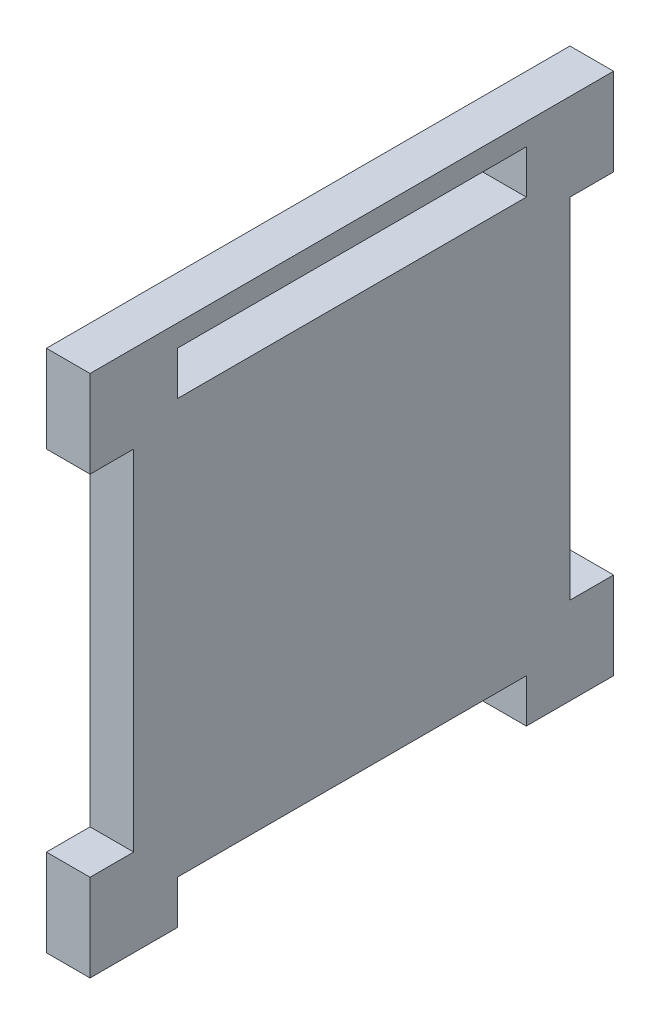
ISO-10303-21;
HEADER;
FILE_DESCRIPTION(('STEP AP214'),'2;1');
FILE_NAME('part.step','',(''),(''),'','','');
FILE_SCHEMA(('AUTOMOTIVE_DESIGN { 1 0 10303 214 1 1 1 1 }'));
ENDSEC;
DATA;
#1=APPLICATION_CONTEXT('core data for automotive mechanical design processes');
#2=APPLICATION_PROTOCOL_DEFINITION('international standard','automotive_design',2000,#1);
#3=PRODUCT_CONTEXT('',#1,'mechanical');
#4=PRODUCT('Part','Part','',(#3));
#5=PRODUCT_RELATED_PRODUCT_CATEGORY('part','',(#4));
#6=PRODUCT_DEFINITION_FORMATION('','',#4);
#7=PRODUCT_DEFINITION_CONTEXT('part definition',#1,'design');
#8=PRODUCT_DEFINITION('design','',#6,#7);
#9=PRODUCT_DEFINITION_SHAPE('','',#8);
#10=(LENGTH_UNIT() NAMED_UNIT(*) SI_UNIT(.MILLI.,.METRE.));
#11=(NAMED_UNIT(*) PLANE_ANGLE_UNIT() SI_UNIT($,.RADIAN.));
#12=(NAMED_UNIT(*) SI_UNIT($,.STERADIAN.) SOLID_ANGLE_UNIT());
#13=UNCERTAINTY_MEASURE_WITH_UNIT(LENGTH_MEASURE(1.E-05),#10,'distance_accuracy_value','');
#14=(GEOMETRIC_REPRESENTATION_CONTEXT(3) GLOBAL_UNCERTAINTY_ASSIGNED_CONTEXT((#13)) GLOBAL_UNIT_ASSIGNED_CONTEXT((#10,
#11,#12)) REPRESENTATION_CONTEXT('',''));
#15=CARTESIAN_POINT('',(0.,0.,0.));
#16=DIRECTION('',(0.,0.,1.));
#17=DIRECTION('',(1.,0.,0.));
#18=AXIS2_PLACEMENT_3D('',#15,#16,#17);
#19=CARTESIAN_POINT('',(114.3,-38.1,63.5));
#20=DIRECTION('',(0.,1.,0.));
#21=DIRECTION('',(0.,0.,1.));
#22=AXIS2_PLACEMENT_3D('',#19,#20,#21);
#23=PLANE('',#22);
#24=DIRECTION('',(0.,0.,-1.));
#25=VECTOR('',#24,1.);
#26=CARTESIAN_POINT('',(114.3,-38.1,63.5));
#27=LINE('',#26,#25);
#28=CARTESIAN_POINT('',(114.3,-38.1,6.34999999999999));
#29=VERTEX_POINT('',#28);
#30=CARTESIAN_POINT('',(114.3,-38.1,-6.35000000000001));
#31=VERTEX_POINT('',#30);
#32=EDGE_CURVE('E369',#29,#31,#27,.T.);
#33=ORIENTED_EDGE('',*,*,#32,.F.);
#34=DIRECTION('',(-1.,0.,0.));
#35=VECTOR('',#34,1.);
#36=CARTESIAN_POINT('',(114.3,-38.1,6.34999999999999));
#37=LINE('',#36,#35);
#38=CARTESIAN_POINT('',(107.95,-38.1,6.34999999999999));
#39=VERTEX_POINT('',#38);
#40=EDGE_CURVE('E42',#29,#39,#37,.T.);
#41=ORIENTED_EDGE('',*,*,#40,.T.);
#42=DIRECTION('',(0.,0.,-1.));
#43=VECTOR('',#42,1.);
#44=CARTESIAN_POINT('',(107.95,-38.1,63.5));
#45=LINE('',#44,#43);
#46=CARTESIAN_POINT('',(107.95,-38.1,-6.35000000000001));
#47=VERTEX_POINT('',#46);
#48=EDGE_CURVE('E366',#39,#47,#45,.T.);
#49=ORIENTED_EDGE('',*,*,#48,.T.);
#50=DIRECTION('',(1.,0.,0.));
#51=VECTOR('',#50,1.);
#52=CARTESIAN_POINT('',(107.95,-38.1,-6.35000000000001));
#53=LINE('',#52,#51);
#54=EDGE_CURVE('E224',#47,#31,#53,.T.);
#55=ORIENTED_EDGE('',*,*,#54,.T.);
#56=EDGE_LOOP('',(#33,#41,#49,#55));
#57=FACE_BOUND('',#56,.T.);
#58=ADVANCED_FACE('F34',(#57),#23,.F.);
#59=CARTESIAN_POINT('',(0.,0.,63.5));
#60=DIRECTION('',(0.,0.,1.));
#61=DIRECTION('',(1.,0.,0.));
#62=AXIS2_PLACEMENT_3D('',#59,#60,#61);
#63=PLANE('',#62);
#64=DIRECTION('',(1.,0.,0.));
#65=VECTOR('',#64,1.);
#66=CARTESIAN_POINT('',(107.95,25.4,63.5));
#67=LINE('',#66,#65);
#68=CARTESIAN_POINT('',(107.95,25.4,63.5));
#69=VERTEX_POINT('',#68);
#70=CARTESIAN_POINT('',(114.3,25.4,63.5));
#71=VERTEX_POINT('',#70);
#72=EDGE_CURVE('E319',#69,#71,#67,.T.);
#73=ORIENTED_EDGE('',*,*,#72,.F.);
#74=DIRECTION('',(0.,-1.,0.));
#75=VECTOR('',#74,1.);
#76=CARTESIAN_POINT('',(107.95,-38.1,63.5));
#77=LINE('',#76,#75);
#78=CARTESIAN_POINT('',(107.95,-25.4,63.5));
#79=VERTEX_POINT('',#78);
#80=EDGE_CURVE('E280',#69,#79,#77,.T.);
#81=ORIENTED_EDGE('',*,*,#80,.T.);
#82=DIRECTION('',(1.,0.,0.));
#83=VECTOR('',#82,1.);
#84=CARTESIAN_POINT('',(107.95,-25.4,63.5));
#85=LINE('',#84,#83);
#86=CARTESIAN_POINT('',(114.3,-25.4,63.5));
#87=VERTEX_POINT('',#86);
#88=EDGE_CURVE('E335',#79,#87,#85,.T.);
#89=ORIENTED_EDGE('',*,*,#88,.T.);
#90=DIRECTION('',(0.,1.,0.));
#91=VECTOR('',#90,1.);
#92=CARTESIAN_POINT('',(114.3,-38.1,63.5));
#93=LINE('',#92,#91);
#94=EDGE_CURVE('E279',#87,#71,#93,.T.);
#95=ORIENTED_EDGE('',*,*,#94,.T.);
#96=EDGE_LOOP('',(#73,#81,#89,#95));
#97=FACE_BOUND('',#96,.T.);
#98=ADVANCED_FACE('F372',(#97),#63,.T.);
#99=CARTESIAN_POINT('',(114.3,-38.1,63.5));
#100=DIRECTION('',(-1.,0.,0.));
#101=DIRECTION('',(0.,0.,1.));
#102=AXIS2_PLACEMENT_3D('',#99,#100,#101);
#103=PLANE('',#102);
#104=DIRECTION('',(0.,0.,1.));
#105=VECTOR('',#104,1.);
#106=CARTESIAN_POINT('',(114.3,34.925,6.34999999999999));
#107=LINE('',#106,#105);
#108=CARTESIAN_POINT('',(114.3,34.925,6.34999999999999));
#109=VERTEX_POINT('',#108);
#110=CARTESIAN_POINT('',(114.3,34.925,57.15));
#111=VERTEX_POINT('',#110);
#112=EDGE_CURVE('E200',#109,#111,#107,.T.);
#113=ORIENTED_EDGE('',*,*,#112,.F.);
#114=DIRECTION('',(0.,1.,0.));
#115=VECTOR('',#114,1.);
#116=CARTESIAN_POINT('',(114.3,28.575,6.34999999999999));
#117=LINE('',#116,#115);
#118=CARTESIAN_POINT('',(114.3,28.575,6.34999999999999));
#119=VERTEX_POINT('',#118);
#120=EDGE_CURVE('E57',#119,#109,#117,.T.);
#121=ORIENTED_EDGE('',*,*,#120,.F.);
#122=DIRECTION('',(0.,0.,-1.));
#123=VECTOR('',#122,1.);
#124=CARTESIAN_POINT('',(114.3,28.575,57.15));
#125=LINE('',#124,#123);
#126=CARTESIAN_POINT('',(114.3,28.575,57.15));
#127=VERTEX_POINT('',#126);
#128=EDGE_CURVE('E206',#127,#119,#125,.T.);
#129=ORIENTED_EDGE('',*,*,#128,.F.);
#130=DIRECTION('',(0.,-1.,0.));
#131=VECTOR('',#130,1.);
#132=CARTESIAN_POINT('',(114.3,34.925,57.15));
#133=LINE('',#132,#131);
#134=EDGE_CURVE('E203',#111,#127,#133,.T.);
#135=ORIENTED_EDGE('',*,*,#134,.F.);
#136=EDGE_LOOP('',(#113,#121,#129,#135));
#137=FACE_BOUND('',#136,.T.);
#138=DIRECTION('',(0.,0.,1.));
#139=VECTOR('',#138,1.);
#140=CARTESIAN_POINT('',(114.3,-31.75,6.34999999999999));
#141=LINE('',#140,#139);
#142=CARTESIAN_POINT('',(114.3,-31.75,6.34999999999999));
#143=VERTEX_POINT('',#142);
#144=CARTESIAN_POINT('',(114.3,-31.75,57.15));
#145=VERTEX_POINT('',#144);
#146=EDGE_CURVE('E177',#143,#145,#141,.T.);
#147=ORIENTED_EDGE('',*,*,#146,.F.);
#148=DIRECTION('',(0.,1.,0.));
#149=VECTOR('',#148,1.);
#150=CARTESIAN_POINT('',(114.3,-31.75,6.34999999999999));
#151=LINE('',#150,#149);
#152=EDGE_CURVE('E183',#29,#143,#151,.T.);
#153=ORIENTED_EDGE('',*,*,#152,.F.);
#154=ORIENTED_EDGE('',*,*,#32,.T.);
#155=DIRECTION('',(0.,1.,0.));
#156=VECTOR('',#155,1.);
#157=CARTESIAN_POINT('',(114.3,-38.1,-6.35000000000001));
#158=LINE('',#157,#156);
#159=CARTESIAN_POINT('',(114.3,-25.4,-6.35000000000001));
#160=VERTEX_POINT('',#159);
#161=EDGE_CURVE('E212',#31,#160,#158,.T.);
#162=ORIENTED_EDGE('',*,*,#161,.T.);
#163=DIRECTION('',(0.,0.,1.));
#164=VECTOR('',#163,1.);
#165=CARTESIAN_POINT('',(114.3,-25.4,-6.35000000000001));
#166=LINE('',#165,#164);
#167=CARTESIAN_POINT('',(114.3,-25.4,0.));
#168=VERTEX_POINT('',#167);
#169=EDGE_CURVE('E222',#160,#168,#166,.T.);
#170=ORIENTED_EDGE('',*,*,#169,.T.);
#171=DIRECTION('',(0.,1.,0.));
#172=VECTOR('',#171,1.);
#173=CARTESIAN_POINT('',(114.3,-38.1,0.));
#174=LINE('',#173,#172);
#175=CARTESIAN_POINT('',(114.3,25.4,0.));
#176=VERTEX_POINT('',#175);
#177=EDGE_CURVE('E260',#168,#176,#174,.T.);
#178=ORIENTED_EDGE('',*,*,#177,.T.);
#179=DIRECTION('',(0.,0.,-1.));
#180=VECTOR('',#179,1.);
#181=CARTESIAN_POINT('',(114.3,25.4,0.));
#182=LINE('',#181,#180);
#183=CARTESIAN_POINT('',(114.3,25.4,-6.34999999999999));
#184=VERTEX_POINT('',#183);
#185=EDGE_CURVE('E231',#176,#184,#182,.T.);
#186=ORIENTED_EDGE('',*,*,#185,.T.);
#187=DIRECTION('',(0.,1.,0.));
#188=VECTOR('',#187,1.);
#189=CARTESIAN_POINT('',(114.3,25.4,-6.34999999999999));
#190=LINE('',#189,#188);
#191=CARTESIAN_POINT('',(114.3,38.1,-6.34999999999999));
#192=VERTEX_POINT('',#191);
#193=EDGE_CURVE('E241',#184,#192,#190,.T.);
#194=ORIENTED_EDGE('',*,*,#193,.T.);
#195=DIRECTION('',(0.,0.,-1.));
#196=VECTOR('',#195,1.);
#197=CARTESIAN_POINT('',(114.3,38.1,63.5));
#198=LINE('',#197,#196);
#199=CARTESIAN_POINT('',(114.3,38.1,69.85));
#200=VERTEX_POINT('',#199);
#201=EDGE_CURVE('E362',#200,#192,#198,.T.);
#202=ORIENTED_EDGE('',*,*,#201,.F.);
#203=DIRECTION('',(0.,-1.,0.));
#204=VECTOR('',#203,1.);
#205=CARTESIAN_POINT('',(114.3,25.4,69.85));
#206=LINE('',#205,#204);
#207=CARTESIAN_POINT('',(114.3,25.4,69.85));
#208=VERTEX_POINT('',#207);
#209=EDGE_CURVE('E253',#200,#208,#206,.T.);
#210=ORIENTED_EDGE('',*,*,#209,.T.);
#211=DIRECTION('',(0.,0.,-1.));
#212=VECTOR('',#211,1.);
#213=CARTESIAN_POINT('',(114.3,25.4,63.5));
#214=LINE('',#213,#212);
#215=EDGE_CURVE('E311',#208,#71,#214,.T.);
#216=ORIENTED_EDGE('',*,*,#215,.T.);
#217=ORIENTED_EDGE('',*,*,#94,.F.);
#218=DIRECTION('',(0.,0.,1.));
#219=VECTOR('',#218,1.);
#220=CARTESIAN_POINT('',(114.3,-25.4,69.85));
#221=LINE('',#220,#219);
#222=CARTESIAN_POINT('',(114.3,-25.4,69.85));
#223=VERTEX_POINT('',#222);
#224=EDGE_CURVE('E331',#87,#223,#221,.T.);
#225=ORIENTED_EDGE('',*,*,#224,.T.);
#226=DIRECTION('',(0.,-1.,0.));
#227=VECTOR('',#226,1.);
#228=CARTESIAN_POINT('',(114.3,-38.1,69.85));
#229=LINE('',#228,#227);
#230=CARTESIAN_POINT('',(114.3,-38.1,69.85));
#231=VERTEX_POINT('',#230);
#232=EDGE_CURVE('E322',#223,#231,#229,.T.);
#233=ORIENTED_EDGE('',*,*,#232,.T.);
#234=CARTESIAN_POINT('',(114.3,-38.1,57.15));
#235=VERTEX_POINT('',#234);
#236=EDGE_CURVE('E274',#231,#235,#27,.T.);
#237=ORIENTED_EDGE('',*,*,#236,.T.);
#238=DIRECTION('',(0.,-1.,0.));
#239=VECTOR('',#238,1.);
#240=CARTESIAN_POINT('',(114.3,-31.75,57.15));
#241=LINE('',#240,#239);
#242=EDGE_CURVE('E49',#145,#235,#241,.T.);
#243=ORIENTED_EDGE('',*,*,#242,.F.);
#244=EDGE_LOOP('',(#147,#153,#154,#162,#170,#178,#186,#194,#202,#210,#216,#217,#225,#233,#237,#243));
#245=FACE_BOUND('',#244,.T.);
#246=ADVANCED_FACE('F36',(#137,#245),#103,.F.);
#247=CARTESIAN_POINT('',(114.3,38.1,63.5));
#248=DIRECTION('',(0.,-1.,0.));
#249=DIRECTION('',(0.,0.,-1.));
#250=AXIS2_PLACEMENT_3D('',#247,#248,#249);
#251=PLANE('',#250);
#252=ORIENTED_EDGE('',*,*,#201,.T.);
#253=DIRECTION('',(1.,0.,0.));
#254=VECTOR('',#253,1.);
#255=CARTESIAN_POINT('',(107.95,38.1,-6.34999999999999));
#256=LINE('',#255,#254);
#257=CARTESIAN_POINT('',(107.95,38.1,-6.34999999999999));
#258=VERTEX_POINT('',#257);
#259=EDGE_CURVE('E246',#258,#192,#256,.T.);
#260=ORIENTED_EDGE('',*,*,#259,.F.);
#261=DIRECTION('',(0.,0.,-1.));
#262=VECTOR('',#261,1.);
#263=CARTESIAN_POINT('',(107.95,38.1,63.5));
#264=LINE('',#263,#262);
#265=CARTESIAN_POINT('',(107.95,38.1,69.85));
#266=VERTEX_POINT('',#265);
#267=EDGE_CURVE('E301',#266,#258,#264,.T.);
#268=ORIENTED_EDGE('',*,*,#267,.F.);
#269=DIRECTION('',(1.,0.,0.));
#270=VECTOR('',#269,1.);
#271=CARTESIAN_POINT('',(107.95,38.1,69.85));
#272=LINE('',#271,#270);
#273=EDGE_CURVE('E314',#266,#200,#272,.T.);
#274=ORIENTED_EDGE('',*,*,#273,.T.);
#275=EDGE_LOOP('',(#252,#260,#268,#274));
#276=FACE_BOUND('',#275,.T.);
#277=ADVANCED_FACE('F423',(#276),#251,.F.);
#278=CARTESIAN_POINT('',(107.95,-38.1,63.5));
#279=DIRECTION('',(1.,0.,0.));
#280=DIRECTION('',(0.,0.,-1.));
#281=AXIS2_PLACEMENT_3D('',#278,#279,#280);
#282=PLANE('',#281);
#283=ORIENTED_EDGE('',*,*,#48,.F.);
#284=DIRECTION('',(0.,1.,0.));
#285=VECTOR('',#284,1.);
#286=CARTESIAN_POINT('',(107.95,-38.1,6.34999999999999));
#287=LINE('',#286,#285);
#288=CARTESIAN_POINT('',(107.95,-31.75,6.34999999999999));
#289=VERTEX_POINT('',#288);
#290=EDGE_CURVE('E197',#39,#289,#287,.T.);
#291=ORIENTED_EDGE('',*,*,#290,.T.);
#292=DIRECTION('',(0.,0.,1.));
#293=VECTOR('',#292,1.);
#294=CARTESIAN_POINT('',(107.95,-31.75,63.5));
#295=LINE('',#294,#293);
#296=CARTESIAN_POINT('',(107.95,-31.75,57.15));
#297=VERTEX_POINT('',#296);
#298=EDGE_CURVE('E12',#289,#297,#295,.T.);
#299=ORIENTED_EDGE('',*,*,#298,.T.);
#300=DIRECTION('',(0.,-1.,0.));
#301=VECTOR('',#300,1.);
#302=CARTESIAN_POINT('',(107.95,-38.1,57.15));
#303=LINE('',#302,#301);
#304=CARTESIAN_POINT('',(107.95,-38.1,57.15));
#305=VERTEX_POINT('',#304);
#306=EDGE_CURVE('E193',#297,#305,#303,.T.);
#307=ORIENTED_EDGE('',*,*,#306,.T.);
#308=CARTESIAN_POINT('',(107.95,-38.1,69.85));
#309=VERTEX_POINT('',#308);
#310=EDGE_CURVE('E365',#309,#305,#45,.T.);
#311=ORIENTED_EDGE('',*,*,#310,.F.);
#312=DIRECTION('',(0.,-1.,0.));
#313=VECTOR('',#312,1.);
#314=CARTESIAN_POINT('',(107.95,-38.1,69.85));
#315=LINE('',#314,#313);
#316=CARTESIAN_POINT('',(107.95,-25.4,69.85));
#317=VERTEX_POINT('',#316);
#318=EDGE_CURVE('E327',#317,#309,#315,.T.);
#319=ORIENTED_EDGE('',*,*,#318,.F.);
#320=DIRECTION('',(0.,0.,1.));
#321=VECTOR('',#320,1.);
#322=CARTESIAN_POINT('',(107.95,-25.4,69.85));
#323=LINE('',#322,#321);
#324=EDGE_CURVE('E330',#79,#317,#323,.T.);
#325=ORIENTED_EDGE('',*,*,#324,.F.);
#326=ORIENTED_EDGE('',*,*,#80,.F.);
#327=DIRECTION('',(0.,0.,-1.));
#328=VECTOR('',#327,1.);
#329=CARTESIAN_POINT('',(107.95,25.4,63.5));
#330=LINE('',#329,#328);
#331=CARTESIAN_POINT('',(107.95,25.4,69.85));
#332=VERTEX_POINT('',#331);
#333=EDGE_CURVE('E310',#332,#69,#330,.T.);
#334=ORIENTED_EDGE('',*,*,#333,.F.);
#335=DIRECTION('',(0.,-1.,0.));
#336=VECTOR('',#335,1.);
#337=CARTESIAN_POINT('',(107.95,25.4,69.85));
#338=LINE('',#337,#336);
#339=EDGE_CURVE('E307',#266,#332,#338,.T.);
#340=ORIENTED_EDGE('',*,*,#339,.F.);
#341=ORIENTED_EDGE('',*,*,#267,.T.);
#342=DIRECTION('',(0.,1.,0.));
#343=VECTOR('',#342,1.);
#344=CARTESIAN_POINT('',(107.95,25.4,-6.34999999999999));
#345=LINE('',#344,#343);
#346=CARTESIAN_POINT('',(107.95,25.4,-6.34999999999999));
#347=VERTEX_POINT('',#346);
#348=EDGE_CURVE('E236',#347,#258,#345,.T.);
#349=ORIENTED_EDGE('',*,*,#348,.F.);
#350=DIRECTION('',(0.,0.,-1.));
#351=VECTOR('',#350,1.);
#352=CARTESIAN_POINT('',(107.95,25.4,0.));
#353=LINE('',#352,#351);
#354=CARTESIAN_POINT('',(107.95,25.4,0.));
#355=VERTEX_POINT('',#354);
#356=EDGE_CURVE('E240',#355,#347,#353,.T.);
#357=ORIENTED_EDGE('',*,*,#356,.F.);
#358=DIRECTION('',(0.,-1.,0.));
#359=VECTOR('',#358,1.);
#360=CARTESIAN_POINT('',(107.95,-38.1,0.));
#361=LINE('',#360,#359);
#362=CARTESIAN_POINT('',(107.95,-25.4,0.));
#363=VERTEX_POINT('',#362);
#364=EDGE_CURVE('E263',#355,#363,#361,.T.);
#365=ORIENTED_EDGE('',*,*,#364,.T.);
#366=DIRECTION('',(0.,0.,1.));
#367=VECTOR('',#366,1.);
#368=CARTESIAN_POINT('',(107.95,-25.4,-6.35000000000001));
#369=LINE('',#368,#367);
#370=CARTESIAN_POINT('',(107.95,-25.4,-6.35000000000001));
#371=VERTEX_POINT('',#370);
#372=EDGE_CURVE('E221',#371,#363,#369,.T.);
#373=ORIENTED_EDGE('',*,*,#372,.F.);
#374=DIRECTION('',(0.,1.,0.));
#375=VECTOR('',#374,1.);
#376=CARTESIAN_POINT('',(107.95,-38.1,-6.35000000000001));
#377=LINE('',#376,#375);
#378=EDGE_CURVE('E218',#47,#371,#377,.T.);
#379=ORIENTED_EDGE('',*,*,#378,.F.);
#380=EDGE_LOOP('',(#283,#291,#299,#307,#311,#319,#325,#326,#334,#340,#341,#349,#357,#365,#373,#379));
#381=FACE_BOUND('',#380,.T.);
#382=DIRECTION('',(0.,0.,-1.));
#383=VECTOR('',#382,1.);
#384=CARTESIAN_POINT('',(107.95,28.575,63.5));
#385=LINE('',#384,#383);
#386=CARTESIAN_POINT('',(107.95,28.575,57.15));
#387=VERTEX_POINT('',#386);
#388=CARTESIAN_POINT('',(107.95,28.575,6.34999999999999));
#389=VERTEX_POINT('',#388);
#390=EDGE_CURVE('E380',#387,#389,#385,.T.);
#391=ORIENTED_EDGE('',*,*,#390,.T.);
#392=DIRECTION('',(0.,1.,0.));
#393=VECTOR('',#392,1.);
#394=CARTESIAN_POINT('',(107.95,-38.1,6.34999999999999));
#395=LINE('',#394,#393);
#396=CARTESIAN_POINT('',(107.95,34.925,6.34999999999999));
#397=VERTEX_POINT('',#396);
#398=EDGE_CURVE('E377',#389,#397,#395,.T.);
#399=ORIENTED_EDGE('',*,*,#398,.T.);
#400=DIRECTION('',(0.,0.,1.));
#401=VECTOR('',#400,1.);
#402=CARTESIAN_POINT('',(107.95,34.925,63.5));
#403=LINE('',#402,#401);
#404=CARTESIAN_POINT('',(107.95,34.925,57.15));
#405=VERTEX_POINT('',#404);
#406=EDGE_CURVE('E265',#397,#405,#403,.T.);
#407=ORIENTED_EDGE('',*,*,#406,.T.);
#408=DIRECTION('',(0.,-1.,0.));
#409=VECTOR('',#408,1.);
#410=CARTESIAN_POINT('',(107.95,-38.1,57.15));
#411=LINE('',#410,#409);
#412=EDGE_CURVE('E384',#405,#387,#411,.T.);
#413=ORIENTED_EDGE('',*,*,#412,.T.);
#414=EDGE_LOOP('',(#391,#399,#407,#413));
#415=FACE_BOUND('',#414,.T.);
#416=ADVANCED_FACE('F296',(#381,#415),#282,.F.);
#417=ORIENTED_EDGE('',*,*,#310,.T.);
#418=DIRECTION('',(1.,0.,0.));
#419=VECTOR('',#418,1.);
#420=CARTESIAN_POINT('',(114.3,-38.1,57.15));
#421=LINE('',#420,#419);
#422=EDGE_CURVE('E376',#305,#235,#421,.T.);
#423=ORIENTED_EDGE('',*,*,#422,.T.);
#424=ORIENTED_EDGE('',*,*,#236,.F.);
#425=DIRECTION('',(1.,0.,0.));
#426=VECTOR('',#425,1.);
#427=CARTESIAN_POINT('',(107.95,-38.1,69.85));
#428=LINE('',#427,#426);
#429=EDGE_CURVE('E338',#309,#231,#428,.T.);
#430=ORIENTED_EDGE('',*,*,#429,.F.);
#431=EDGE_LOOP('',(#417,#423,#424,#430));
#432=FACE_BOUND('',#431,.T.);
#433=ADVANCED_FACE('F411',(#432),#23,.F.);
#434=CARTESIAN_POINT('',(0.,0.,0.));
#435=DIRECTION('',(0.,0.,1.));
#436=DIRECTION('',(1.,0.,0.));
#437=AXIS2_PLACEMENT_3D('',#434,#435,#436);
#438=PLANE('',#437);
#439=ORIENTED_EDGE('',*,*,#177,.F.);
#440=DIRECTION('',(1.,0.,0.));
#441=VECTOR('',#440,1.);
#442=CARTESIAN_POINT('',(107.95,-25.4,0.));
#443=LINE('',#442,#441);
#444=EDGE_CURVE('E228',#363,#168,#443,.T.);
#445=ORIENTED_EDGE('',*,*,#444,.F.);
#446=ORIENTED_EDGE('',*,*,#364,.F.);
#447=DIRECTION('',(1.,0.,0.));
#448=VECTOR('',#447,1.);
#449=CARTESIAN_POINT('',(107.95,25.4,0.));
#450=LINE('',#449,#448);
#451=EDGE_CURVE('E249',#355,#176,#450,.T.);
#452=ORIENTED_EDGE('',*,*,#451,.T.);
#453=EDGE_LOOP('',(#439,#445,#446,#452));
#454=FACE_BOUND('',#453,.T.);
#455=ADVANCED_FACE('F291',(#454),#438,.F.);
#456=CARTESIAN_POINT('',(107.95,-38.1,69.85));
#457=DIRECTION('',(0.,0.,1.));
#458=DIRECTION('',(1.,0.,0.));
#459=AXIS2_PLACEMENT_3D('',#456,#457,#458);
#460=PLANE('',#459);
#461=ORIENTED_EDGE('',*,*,#232,.F.);
#462=DIRECTION('',(1.,0.,0.));
#463=VECTOR('',#462,1.);
#464=CARTESIAN_POINT('',(107.95,-25.4,69.85));
#465=LINE('',#464,#463);
#466=EDGE_CURVE('E264',#317,#223,#465,.T.);
#467=ORIENTED_EDGE('',*,*,#466,.F.);
#468=ORIENTED_EDGE('',*,*,#318,.T.);
#469=ORIENTED_EDGE('',*,*,#429,.T.);
#470=EDGE_LOOP('',(#461,#467,#468,#469));
#471=FACE_BOUND('',#470,.T.);
#472=ADVANCED_FACE('F354',(#471),#460,.T.);
#473=CARTESIAN_POINT('',(107.95,-25.4,69.85));
#474=DIRECTION('',(0.,1.,0.));
#475=DIRECTION('',(0.,0.,1.));
#476=AXIS2_PLACEMENT_3D('',#473,#474,#475);
#477=PLANE('',#476);
#478=ORIENTED_EDGE('',*,*,#224,.F.);
#479=ORIENTED_EDGE('',*,*,#88,.F.);
#480=ORIENTED_EDGE('',*,*,#324,.T.);
#481=ORIENTED_EDGE('',*,*,#466,.T.);
#482=EDGE_LOOP('',(#478,#479,#480,#481));
#483=FACE_BOUND('',#482,.T.);
#484=ADVANCED_FACE('F374',(#483),#477,.T.);
#485=CARTESIAN_POINT('',(107.95,25.4,63.5));
#486=DIRECTION('',(0.,-1.,0.));
#487=DIRECTION('',(0.,0.,-1.));
#488=AXIS2_PLACEMENT_3D('',#485,#486,#487);
#489=PLANE('',#488);
#490=ORIENTED_EDGE('',*,*,#215,.F.);
#491=DIRECTION('',(1.,0.,0.));
#492=VECTOR('',#491,1.);
#493=CARTESIAN_POINT('',(107.95,25.4,69.85));
#494=LINE('',#493,#492);
#495=EDGE_CURVE('E323',#332,#208,#494,.T.);
#496=ORIENTED_EDGE('',*,*,#495,.F.);
#497=ORIENTED_EDGE('',*,*,#333,.T.);
#498=ORIENTED_EDGE('',*,*,#72,.T.);
#499=EDGE_LOOP('',(#490,#496,#497,#498));
#500=FACE_BOUND('',#499,.T.);
#501=ADVANCED_FACE('F436',(#500),#489,.T.);
#502=CARTESIAN_POINT('',(107.95,25.4,69.85));
#503=DIRECTION('',(0.,0.,1.));
#504=DIRECTION('',(1.,0.,0.));
#505=AXIS2_PLACEMENT_3D('',#502,#503,#504);
#506=PLANE('',#505);
#507=ORIENTED_EDGE('',*,*,#209,.F.);
#508=ORIENTED_EDGE('',*,*,#273,.F.);
#509=ORIENTED_EDGE('',*,*,#339,.T.);
#510=ORIENTED_EDGE('',*,*,#495,.T.);
#511=EDGE_LOOP('',(#507,#508,#509,#510));
#512=FACE_BOUND('',#511,.T.);
#513=ADVANCED_FACE('F437',(#512),#506,.T.);
#514=CARTESIAN_POINT('',(107.95,25.4,0.));
#515=DIRECTION('',(0.,-1.,0.));
#516=DIRECTION('',(0.,0.,-1.));
#517=AXIS2_PLACEMENT_3D('',#514,#515,#516);
#518=PLANE('',#517);
#519=ORIENTED_EDGE('',*,*,#185,.F.);
#520=ORIENTED_EDGE('',*,*,#451,.F.);
#521=ORIENTED_EDGE('',*,*,#356,.T.);
#522=DIRECTION('',(1.,0.,0.));
#523=VECTOR('',#522,1.);
#524=CARTESIAN_POINT('',(107.95,25.4,-6.34999999999999));
#525=LINE('',#524,#523);
#526=EDGE_CURVE('E239',#347,#184,#525,.T.);
#527=ORIENTED_EDGE('',*,*,#526,.T.);
#528=EDGE_LOOP('',(#519,#520,#521,#527));
#529=FACE_BOUND('',#528,.T.);
#530=ADVANCED_FACE('F287',(#529),#518,.T.);
#531=CARTESIAN_POINT('',(107.95,25.4,-6.34999999999999));
#532=DIRECTION('',(0.,0.,-1.));
#533=DIRECTION('',(-1.,0.,0.));
#534=AXIS2_PLACEMENT_3D('',#531,#532,#533);
#535=PLANE('',#534);
#536=ORIENTED_EDGE('',*,*,#193,.F.);
#537=ORIENTED_EDGE('',*,*,#526,.F.);
#538=ORIENTED_EDGE('',*,*,#348,.T.);
#539=ORIENTED_EDGE('',*,*,#259,.T.);
#540=EDGE_LOOP('',(#536,#537,#538,#539));
#541=FACE_BOUND('',#540,.T.);
#542=ADVANCED_FACE('F305',(#541),#535,.T.);
#543=CARTESIAN_POINT('',(107.95,-25.4,-6.35000000000001));
#544=DIRECTION('',(0.,1.,0.));
#545=DIRECTION('',(0.,0.,1.));
#546=AXIS2_PLACEMENT_3D('',#543,#544,#545);
#547=PLANE('',#546);
#548=ORIENTED_EDGE('',*,*,#169,.F.);
#549=DIRECTION('',(1.,0.,0.));
#550=VECTOR('',#549,1.);
#551=CARTESIAN_POINT('',(107.95,-25.4,-6.35000000000001));
#552=LINE('',#551,#550);
#553=EDGE_CURVE('E232',#371,#160,#552,.T.);
#554=ORIENTED_EDGE('',*,*,#553,.F.);
#555=ORIENTED_EDGE('',*,*,#372,.T.);
#556=ORIENTED_EDGE('',*,*,#444,.T.);
#557=EDGE_LOOP('',(#548,#554,#555,#556));
#558=FACE_BOUND('',#557,.T.);
#559=ADVANCED_FACE('F481',(#558),#547,.T.);
#560=CARTESIAN_POINT('',(107.95,-38.1,-6.35000000000001));
#561=DIRECTION('',(0.,0.,-1.));
#562=DIRECTION('',(-1.,0.,0.));
#563=AXIS2_PLACEMENT_3D('',#560,#561,#562);
#564=PLANE('',#563);
#565=ORIENTED_EDGE('',*,*,#161,.F.);
#566=ORIENTED_EDGE('',*,*,#54,.F.);
#567=ORIENTED_EDGE('',*,*,#378,.T.);
#568=ORIENTED_EDGE('',*,*,#553,.T.);
#569=EDGE_LOOP('',(#565,#566,#567,#568));
#570=FACE_BOUND('',#569,.T.);
#571=ADVANCED_FACE('F490',(#570),#564,.T.);
#572=CARTESIAN_POINT('',(107.94995,28.575,6.34999999999999));
#573=DIRECTION('',(0.,0.,-1.));
#574=DIRECTION('',(-1.,0.,0.));
#575=AXIS2_PLACEMENT_3D('',#572,#573,#574);
#576=PLANE('',#575);
#577=DIRECTION('',(1.,0.,0.));
#578=VECTOR('',#577,1.);
#579=CARTESIAN_POINT('',(107.94995,28.575,6.34999999999999));
#580=LINE('',#579,#578);
#581=EDGE_CURVE('E210',#389,#119,#580,.T.);
#582=ORIENTED_EDGE('',*,*,#581,.T.);
#583=ORIENTED_EDGE('',*,*,#120,.T.);
#584=DIRECTION('',(1.,0.,0.));
#585=VECTOR('',#584,1.);
#586=CARTESIAN_POINT('',(107.94995,34.925,6.34999999999999));
#587=LINE('',#586,#585);
#588=EDGE_CURVE('E209',#397,#109,#587,.T.);
#589=ORIENTED_EDGE('',*,*,#588,.F.);
#590=ORIENTED_EDGE('',*,*,#398,.F.);
#591=EDGE_LOOP('',(#582,#583,#589,#590));
#592=FACE_BOUND('',#591,.T.);
#593=ADVANCED_FACE('F391',(#592),#576,.F.);
#594=CARTESIAN_POINT('',(107.94995,28.575,57.15));
#595=DIRECTION('',(0.,-1.,0.));
#596=DIRECTION('',(0.,0.,-1.));
#597=AXIS2_PLACEMENT_3D('',#594,#595,#596);
#598=PLANE('',#597);
#599=DIRECTION('',(1.,0.,0.));
#600=VECTOR('',#599,1.);
#601=CARTESIAN_POINT('',(107.94995,28.575,57.15));
#602=LINE('',#601,#600);
#603=EDGE_CURVE('E213',#387,#127,#602,.T.);
#604=ORIENTED_EDGE('',*,*,#603,.T.);
#605=ORIENTED_EDGE('',*,*,#128,.T.);
#606=ORIENTED_EDGE('',*,*,#581,.F.);
#607=ORIENTED_EDGE('',*,*,#390,.F.);
#608=EDGE_LOOP('',(#604,#605,#606,#607));
#609=FACE_BOUND('',#608,.T.);
#610=ADVANCED_FACE('F394',(#609),#598,.F.);
#611=CARTESIAN_POINT('',(107.94995,34.925,57.15));
#612=DIRECTION('',(0.,0.,1.));
#613=DIRECTION('',(1.,0.,0.));
#614=AXIS2_PLACEMENT_3D('',#611,#612,#613);
#615=PLANE('',#614);
#616=DIRECTION('',(1.,0.,0.));
#617=VECTOR('',#616,1.);
#618=CARTESIAN_POINT('',(107.94995,34.925,57.15));
#619=LINE('',#618,#617);
#620=EDGE_CURVE('E215',#405,#111,#619,.T.);
#621=ORIENTED_EDGE('',*,*,#620,.T.);
#622=ORIENTED_EDGE('',*,*,#134,.T.);
#623=ORIENTED_EDGE('',*,*,#603,.F.);
#624=ORIENTED_EDGE('',*,*,#412,.F.);
#625=EDGE_LOOP('',(#621,#622,#623,#624));
#626=FACE_BOUND('',#625,.T.);
#627=ADVANCED_FACE('F400',(#626),#615,.F.);
#628=CARTESIAN_POINT('',(107.94995,34.925,6.34999999999999));
#629=DIRECTION('',(0.,1.,0.));
#630=DIRECTION('',(0.,0.,1.));
#631=AXIS2_PLACEMENT_3D('',#628,#629,#630);
#632=PLANE('',#631);
#633=ORIENTED_EDGE('',*,*,#588,.T.);
#634=ORIENTED_EDGE('',*,*,#112,.T.);
#635=ORIENTED_EDGE('',*,*,#620,.F.);
#636=ORIENTED_EDGE('',*,*,#406,.F.);
#637=EDGE_LOOP('',(#633,#634,#635,#636));
#638=FACE_BOUND('',#637,.T.);
#639=ADVANCED_FACE('F389',(#638),#632,.F.);
#640=CARTESIAN_POINT('',(107.94995,-31.75,6.34999999999999));
#641=DIRECTION('',(0.,1.,0.));
#642=DIRECTION('',(0.,0.,1.));
#643=AXIS2_PLACEMENT_3D('',#640,#641,#642);
#644=PLANE('',#643);
#645=DIRECTION('',(1.,0.,0.));
#646=VECTOR('',#645,1.);
#647=CARTESIAN_POINT('',(107.94995,-31.75,6.34999999999999));
#648=LINE('',#647,#646);
#649=EDGE_CURVE('E172',#289,#143,#648,.T.);
#650=ORIENTED_EDGE('',*,*,#649,.T.);
#651=ORIENTED_EDGE('',*,*,#146,.T.);
#652=DIRECTION('',(1.,0.,0.));
#653=VECTOR('',#652,1.);
#654=CARTESIAN_POINT('',(107.94995,-31.75,57.15));
#655=LINE('',#654,#653);
#656=EDGE_CURVE('E180',#297,#145,#655,.T.);
#657=ORIENTED_EDGE('',*,*,#656,.F.);
#658=ORIENTED_EDGE('',*,*,#298,.F.);
#659=EDGE_LOOP('',(#650,#651,#657,#658));
#660=FACE_BOUND('',#659,.T.);
#661=ADVANCED_FACE('F174',(#660),#644,.F.);
#662=CARTESIAN_POINT('',(107.94995,-31.75,6.34999999999999));
#663=DIRECTION('',(0.,0.,-1.));
#664=DIRECTION('',(-1.,0.,0.));
#665=AXIS2_PLACEMENT_3D('',#662,#663,#664);
#666=PLANE('',#665);
#667=ORIENTED_EDGE('',*,*,#40,.F.);
#668=ORIENTED_EDGE('',*,*,#152,.T.);
#669=ORIENTED_EDGE('',*,*,#649,.F.);
#670=ORIENTED_EDGE('',*,*,#290,.F.);
#671=EDGE_LOOP('',(#667,#668,#669,#670));
#672=FACE_BOUND('',#671,.T.);
#673=ADVANCED_FACE('F184',(#672),#666,.F.);
#674=CARTESIAN_POINT('',(107.94995,-31.75,57.15));
#675=DIRECTION('',(0.,0.,1.));
#676=DIRECTION('',(1.,0.,0.));
#677=AXIS2_PLACEMENT_3D('',#674,#675,#676);
#678=PLANE('',#677);
#679=ORIENTED_EDGE('',*,*,#656,.T.);
#680=ORIENTED_EDGE('',*,*,#242,.T.);
#681=ORIENTED_EDGE('',*,*,#422,.F.);
#682=ORIENTED_EDGE('',*,*,#306,.F.);
#683=EDGE_LOOP('',(#679,#680,#681,#682));
#684=FACE_BOUND('',#683,.T.);
#685=ADVANCED_FACE('F375',(#684),#678,.F.);
#686=CLOSED_SHELL('',(#58,#98,#246,#277,#416,#433,#455,#472,#484,#501,#513,#530,#542,#559,#571,
#593,#610,#627,#639,#661,#673,#685));
#687=MANIFOLD_SOLID_BREP('B2',#686);
#688=ADVANCED_BREP_SHAPE_REPRESENTATION('',(#18,#687),#14);
#689=SHAPE_DEFINITION_REPRESENTATION(#9,#688);
ENDSEC;
END-ISO-10303-21;
